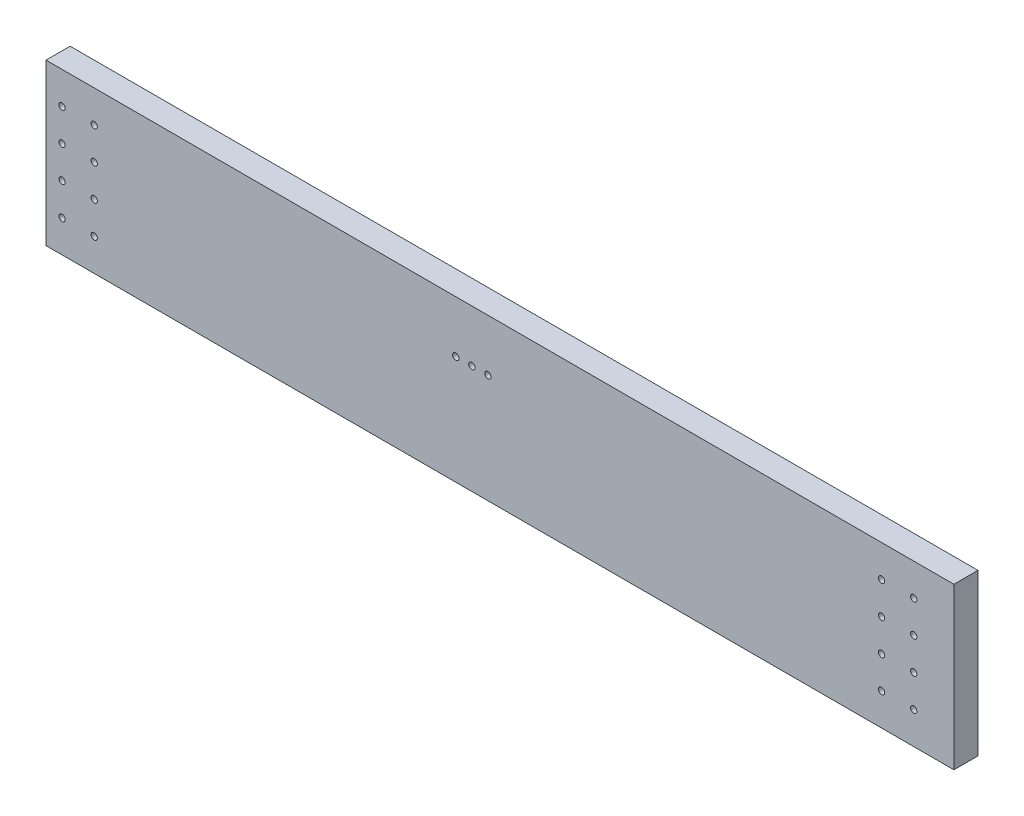
ISO-10303-21;
HEADER;
FILE_DESCRIPTION(('STEP AP214'),'2;1');
FILE_NAME('part.step','',(''),(''),'','','');
FILE_SCHEMA(('AUTOMOTIVE_DESIGN { 1 0 10303 214 1 1 1 1 }'));
ENDSEC;
DATA;
#1=APPLICATION_CONTEXT('core data for automotive mechanical design processes');
#2=APPLICATION_PROTOCOL_DEFINITION('international standard','automotive_design',2000,#1);
#3=PRODUCT_CONTEXT('',#1,'mechanical');
#4=PRODUCT('Part','Part','',(#3));
#5=PRODUCT_RELATED_PRODUCT_CATEGORY('part','',(#4));
#6=PRODUCT_DEFINITION_FORMATION('','',#4);
#7=PRODUCT_DEFINITION_CONTEXT('part definition',#1,'design');
#8=PRODUCT_DEFINITION('design','',#6,#7);
#9=PRODUCT_DEFINITION_SHAPE('','',#8);
#10=(LENGTH_UNIT() NAMED_UNIT(*) SI_UNIT(.MILLI.,.METRE.));
#11=(NAMED_UNIT(*) PLANE_ANGLE_UNIT() SI_UNIT($,.RADIAN.));
#12=(NAMED_UNIT(*) SI_UNIT($,.STERADIAN.) SOLID_ANGLE_UNIT());
#13=UNCERTAINTY_MEASURE_WITH_UNIT(LENGTH_MEASURE(1.E-05),#10,'distance_accuracy_value','');
#14=(GEOMETRIC_REPRESENTATION_CONTEXT(3) GLOBAL_UNCERTAINTY_ASSIGNED_CONTEXT((#13)) GLOBAL_UNIT_ASSIGNED_CONTEXT((#10,
#11,#12)) REPRESENTATION_CONTEXT('',''));
#15=CARTESIAN_POINT('',(0.,0.,0.));
#16=DIRECTION('',(0.,0.,1.));
#17=DIRECTION('',(1.,0.,0.));
#18=AXIS2_PLACEMENT_3D('',#15,#16,#17);
#19=CARTESIAN_POINT('',(0.,0.,19.05));
#20=DIRECTION('',(0.,1.,0.));
#21=DIRECTION('',(0.,0.,1.));
#22=AXIS2_PLACEMENT_3D('',#19,#20,#21);
#23=PLANE('',#22);
#24=DIRECTION('',(1.,0.,0.));
#25=VECTOR('',#24,1.);
#26=CARTESIAN_POINT('',(0.,0.,0.));
#27=LINE('',#26,#25);
#28=CARTESIAN_POINT('',(0.,0.,0.));
#29=VERTEX_POINT('',#28);
#30=CARTESIAN_POINT('',(717.55,0.,0.));
#31=VERTEX_POINT('',#30);
#32=EDGE_CURVE('E119',#29,#31,#27,.T.);
#33=ORIENTED_EDGE('',*,*,#32,.T.);
#34=DIRECTION('',(0.,0.,-1.));
#35=VECTOR('',#34,1.);
#36=CARTESIAN_POINT('',(717.55,0.,19.05));
#37=LINE('',#36,#35);
#38=CARTESIAN_POINT('',(717.55,0.,19.05));
#39=VERTEX_POINT('',#38);
#40=EDGE_CURVE('E11',#39,#31,#37,.T.);
#41=ORIENTED_EDGE('',*,*,#40,.F.);
#42=DIRECTION('',(1.,0.,0.));
#43=VECTOR('',#42,1.);
#44=CARTESIAN_POINT('',(0.,0.,19.05));
#45=LINE('',#44,#43);
#46=CARTESIAN_POINT('',(0.,0.,19.05));
#47=VERTEX_POINT('',#46);
#48=EDGE_CURVE('E99',#47,#39,#45,.T.);
#49=ORIENTED_EDGE('',*,*,#48,.F.);
#50=DIRECTION('',(0.,0.,-1.));
#51=VECTOR('',#50,1.);
#52=CARTESIAN_POINT('',(0.,0.,19.05));
#53=LINE('',#52,#51);
#54=EDGE_CURVE('E66',#47,#29,#53,.T.);
#55=ORIENTED_EDGE('',*,*,#54,.T.);
#56=EDGE_LOOP('',(#33,#41,#49,#55));
#57=FACE_BOUND('',#56,.T.);
#58=ADVANCED_FACE('F47',(#57),#23,.F.);
#59=CARTESIAN_POINT('',(717.55,0.,19.05));
#60=DIRECTION('',(-1.,0.,0.));
#61=DIRECTION('',(0.,0.,1.));
#62=AXIS2_PLACEMENT_3D('',#59,#60,#61);
#63=PLANE('',#62);
#64=DIRECTION('',(0.,1.,0.));
#65=VECTOR('',#64,1.);
#66=CARTESIAN_POINT('',(717.55,0.,0.));
#67=LINE('',#66,#65);
#68=CARTESIAN_POINT('',(717.55,127.,0.));
#69=VERTEX_POINT('',#68);
#70=EDGE_CURVE('E105',#31,#69,#67,.T.);
#71=ORIENTED_EDGE('',*,*,#70,.T.);
#72=DIRECTION('',(0.,0.,-1.));
#73=VECTOR('',#72,1.);
#74=CARTESIAN_POINT('',(717.55,127.,19.05));
#75=LINE('',#74,#73);
#76=CARTESIAN_POINT('',(717.55,127.,19.05));
#77=VERTEX_POINT('',#76);
#78=EDGE_CURVE('E57',#77,#69,#75,.T.);
#79=ORIENTED_EDGE('',*,*,#78,.F.);
#80=DIRECTION('',(0.,1.,0.));
#81=VECTOR('',#80,1.);
#82=CARTESIAN_POINT('',(717.55,0.,19.05));
#83=LINE('',#82,#81);
#84=EDGE_CURVE('E91',#39,#77,#83,.T.);
#85=ORIENTED_EDGE('',*,*,#84,.F.);
#86=ORIENTED_EDGE('',*,*,#40,.T.);
#87=EDGE_LOOP('',(#71,#79,#85,#86));
#88=FACE_BOUND('',#87,.T.);
#89=ADVANCED_FACE('F104',(#88),#63,.F.);
#90=CARTESIAN_POINT('',(0.,127.,19.05));
#91=DIRECTION('',(0.,1.,0.));
#92=DIRECTION('',(0.,0.,1.));
#93=AXIS2_PLACEMENT_3D('',#90,#91,#92);
#94=PLANE('',#93);
#95=DIRECTION('',(1.,0.,0.));
#96=VECTOR('',#95,1.);
#97=CARTESIAN_POINT('',(0.,127.,0.));
#98=LINE('',#97,#96);
#99=CARTESIAN_POINT('',(0.,127.,0.));
#100=VERTEX_POINT('',#99);
#101=EDGE_CURVE('E124',#100,#69,#98,.T.);
#102=ORIENTED_EDGE('',*,*,#101,.F.);
#103=DIRECTION('',(0.,0.,-1.));
#104=VECTOR('',#103,1.);
#105=CARTESIAN_POINT('',(0.,127.,19.05));
#106=LINE('',#105,#104);
#107=CARTESIAN_POINT('',(0.,127.,19.05));
#108=VERTEX_POINT('',#107);
#109=EDGE_CURVE('E80',#108,#100,#106,.T.);
#110=ORIENTED_EDGE('',*,*,#109,.F.);
#111=DIRECTION('',(1.,0.,0.));
#112=VECTOR('',#111,1.);
#113=CARTESIAN_POINT('',(0.,127.,19.05));
#114=LINE('',#113,#112);
#115=EDGE_CURVE('E98',#108,#77,#114,.T.);
#116=ORIENTED_EDGE('',*,*,#115,.T.);
#117=ORIENTED_EDGE('',*,*,#78,.T.);
#118=EDGE_LOOP('',(#102,#110,#116,#117));
#119=FACE_BOUND('',#118,.T.);
#120=ADVANCED_FACE('F110',(#119),#94,.T.);
#121=CARTESIAN_POINT('',(0.,0.,19.05));
#122=DIRECTION('',(-1.,0.,0.));
#123=DIRECTION('',(0.,0.,1.));
#124=AXIS2_PLACEMENT_3D('',#121,#122,#123);
#125=PLANE('',#124);
#126=DIRECTION('',(0.,1.,0.));
#127=VECTOR('',#126,1.);
#128=CARTESIAN_POINT('',(0.,0.,0.));
#129=LINE('',#128,#127);
#130=EDGE_CURVE('E127',#29,#100,#129,.T.);
#131=ORIENTED_EDGE('',*,*,#130,.F.);
#132=ORIENTED_EDGE('',*,*,#54,.F.);
#133=DIRECTION('',(0.,1.,0.));
#134=VECTOR('',#133,1.);
#135=CARTESIAN_POINT('',(0.,0.,19.05));
#136=LINE('',#135,#134);
#137=EDGE_CURVE('E112',#47,#108,#136,.T.);
#138=ORIENTED_EDGE('',*,*,#137,.T.);
#139=ORIENTED_EDGE('',*,*,#109,.T.);
#140=EDGE_LOOP('',(#131,#132,#138,#139));
#141=FACE_BOUND('',#140,.T.);
#142=ADVANCED_FACE('F228',(#141),#125,.T.);
#143=CARTESIAN_POINT('',(0.,0.,19.05));
#144=DIRECTION('',(0.,0.,1.));
#145=DIRECTION('',(1.,0.,0.));
#146=AXIS2_PLACEMENT_3D('',#143,#144,#145);
#147=PLANE('',#146);
#148=CARTESIAN_POINT('',(323.85,85.979,19.05));
#149=DIRECTION('',(0.,0.,1.));
#150=DIRECTION('',(1.,0.,0.));
#151=AXIS2_PLACEMENT_3D('',#148,#149,#150);
#152=CIRCLE('',#151,2.48920000000001);
#153=CARTESIAN_POINT('',(326.3392,85.979,19.05));
#154=VERTEX_POINT('',#153);
#155=EDGE_CURVE('E434',#154,#154,#152,.T.);
#156=ORIENTED_EDGE('',*,*,#155,.F.);
#157=EDGE_LOOP('',(#156));
#158=FACE_BOUND('',#157,.T.);
#159=CARTESIAN_POINT('',(336.55,85.979,19.05));
#160=DIRECTION('',(0.,0.,1.));
#161=DIRECTION('',(1.,0.,0.));
#162=AXIS2_PLACEMENT_3D('',#159,#160,#161);
#163=CIRCLE('',#162,2.48920000000001);
#164=CARTESIAN_POINT('',(339.0392,85.979,19.05));
#165=VERTEX_POINT('',#164);
#166=EDGE_CURVE('E457',#165,#165,#163,.T.);
#167=ORIENTED_EDGE('',*,*,#166,.F.);
#168=EDGE_LOOP('',(#167));
#169=FACE_BOUND('',#168,.T.);
#170=CARTESIAN_POINT('',(349.25,85.979,19.05));
#171=DIRECTION('',(0.,0.,1.));
#172=DIRECTION('',(1.,0.,0.));
#173=AXIS2_PLACEMENT_3D('',#170,#171,#172);
#174=CIRCLE('',#173,2.48920000000001);
#175=CARTESIAN_POINT('',(351.7392,85.979,19.05));
#176=VERTEX_POINT('',#175);
#177=EDGE_CURVE('E449',#176,#176,#174,.T.);
#178=ORIENTED_EDGE('',*,*,#177,.F.);
#179=EDGE_LOOP('',(#178));
#180=FACE_BOUND('',#179,.T.);
#181=CARTESIAN_POINT('',(38.1,25.4,19.05));
#182=DIRECTION('',(0.,0.,1.));
#183=DIRECTION('',(1.,0.,0.));
#184=AXIS2_PLACEMENT_3D('',#181,#182,#183);
#185=CIRCLE('',#184,2.4892);
#186=CARTESIAN_POINT('',(40.5892,25.4,19.05));
#187=VERTEX_POINT('',#186);
#188=EDGE_CURVE('E343',#187,#187,#185,.T.);
#189=ORIENTED_EDGE('',*,*,#188,.F.);
#190=EDGE_LOOP('',(#189));
#191=FACE_BOUND('',#190,.T.);
#192=CARTESIAN_POINT('',(12.7,76.2,19.05));
#193=DIRECTION('',(0.,0.,1.));
#194=DIRECTION('',(1.,0.,0.));
#195=AXIS2_PLACEMENT_3D('',#192,#193,#194);
#196=CIRCLE('',#195,2.4892);
#197=CARTESIAN_POINT('',(15.1892,76.2,19.05));
#198=VERTEX_POINT('',#197);
#199=EDGE_CURVE('E336',#198,#198,#196,.T.);
#200=ORIENTED_EDGE('',*,*,#199,.F.);
#201=EDGE_LOOP('',(#200));
#202=FACE_BOUND('',#201,.T.);
#203=CARTESIAN_POINT('',(12.7,50.8,19.05));
#204=DIRECTION('',(0.,0.,1.));
#205=DIRECTION('',(1.,0.,0.));
#206=AXIS2_PLACEMENT_3D('',#203,#204,#205);
#207=CIRCLE('',#206,2.48919999999999);
#208=CARTESIAN_POINT('',(15.1892,50.8,19.05));
#209=VERTEX_POINT('',#208);
#210=EDGE_CURVE('E329',#209,#209,#207,.T.);
#211=ORIENTED_EDGE('',*,*,#210,.F.);
#212=EDGE_LOOP('',(#211));
#213=FACE_BOUND('',#212,.T.);
#214=CARTESIAN_POINT('',(12.7,25.4,19.05));
#215=DIRECTION('',(0.,0.,1.));
#216=DIRECTION('',(1.,0.,0.));
#217=AXIS2_PLACEMENT_3D('',#214,#215,#216);
#218=CIRCLE('',#217,2.4892);
#219=CARTESIAN_POINT('',(15.1892,25.4,19.05));
#220=VERTEX_POINT('',#219);
#221=EDGE_CURVE('E315',#220,#220,#218,.T.);
#222=ORIENTED_EDGE('',*,*,#221,.F.);
#223=EDGE_LOOP('',(#222));
#224=FACE_BOUND('',#223,.T.);
#225=CARTESIAN_POINT('',(38.1,50.8,19.05));
#226=DIRECTION('',(0.,0.,1.));
#227=DIRECTION('',(1.,0.,0.));
#228=AXIS2_PLACEMENT_3D('',#225,#226,#227);
#229=CIRCLE('',#228,2.4892);
#230=CARTESIAN_POINT('',(40.5892,50.8,19.05));
#231=VERTEX_POINT('',#230);
#232=EDGE_CURVE('E346',#231,#231,#229,.T.);
#233=ORIENTED_EDGE('',*,*,#232,.F.);
#234=EDGE_LOOP('',(#233));
#235=FACE_BOUND('',#234,.T.);
#236=CARTESIAN_POINT('',(38.1,76.2,19.05));
#237=DIRECTION('',(0.,0.,1.));
#238=DIRECTION('',(1.,0.,0.));
#239=AXIS2_PLACEMENT_3D('',#236,#237,#238);
#240=CIRCLE('',#239,2.4892);
#241=CARTESIAN_POINT('',(40.5892,76.2,19.05));
#242=VERTEX_POINT('',#241);
#243=EDGE_CURVE('E356',#242,#242,#240,.T.);
#244=ORIENTED_EDGE('',*,*,#243,.F.);
#245=EDGE_LOOP('',(#244));
#246=FACE_BOUND('',#245,.T.);
#247=CARTESIAN_POINT('',(38.1,101.6,19.05));
#248=DIRECTION('',(0.,0.,1.));
#249=DIRECTION('',(1.,0.,0.));
#250=AXIS2_PLACEMENT_3D('',#247,#248,#249);
#251=CIRCLE('',#250,2.4892);
#252=CARTESIAN_POINT('',(40.5892,101.6,19.05));
#253=VERTEX_POINT('',#252);
#254=EDGE_CURVE('E352',#253,#253,#251,.T.);
#255=ORIENTED_EDGE('',*,*,#254,.F.);
#256=EDGE_LOOP('',(#255));
#257=FACE_BOUND('',#256,.T.);
#258=CARTESIAN_POINT('',(685.8,101.6,19.05));
#259=DIRECTION('',(0.,0.,1.));
#260=DIRECTION('',(1.,0.,0.));
#261=AXIS2_PLACEMENT_3D('',#258,#259,#260);
#262=CIRCLE('',#261,2.48919999999995);
#263=CARTESIAN_POINT('',(688.2892,101.6,19.05));
#264=VERTEX_POINT('',#263);
#265=EDGE_CURVE('E272',#264,#264,#262,.T.);
#266=ORIENTED_EDGE('',*,*,#265,.F.);
#267=EDGE_LOOP('',(#266));
#268=FACE_BOUND('',#267,.T.);
#269=CARTESIAN_POINT('',(660.4,101.6,19.05));
#270=DIRECTION('',(0.,0.,1.));
#271=DIRECTION('',(1.,0.,0.));
#272=AXIS2_PLACEMENT_3D('',#269,#270,#271);
#273=CIRCLE('',#272,2.48919999999995);
#274=CARTESIAN_POINT('',(662.8892,101.6,19.05));
#275=VERTEX_POINT('',#274);
#276=EDGE_CURVE('E330',#275,#275,#273,.T.);
#277=ORIENTED_EDGE('',*,*,#276,.F.);
#278=EDGE_LOOP('',(#277));
#279=FACE_BOUND('',#278,.T.);
#280=CARTESIAN_POINT('',(660.4,76.2,19.05));
#281=DIRECTION('',(0.,0.,1.));
#282=DIRECTION('',(1.,0.,0.));
#283=AXIS2_PLACEMENT_3D('',#280,#281,#282);
#284=CIRCLE('',#283,2.48919999999995);
#285=CARTESIAN_POINT('',(662.8892,76.2,19.05));
#286=VERTEX_POINT('',#285);
#287=EDGE_CURVE('E339',#286,#286,#284,.T.);
#288=ORIENTED_EDGE('',*,*,#287,.F.);
#289=EDGE_LOOP('',(#288));
#290=FACE_BOUND('',#289,.T.);
#291=CARTESIAN_POINT('',(660.4,50.8,19.05));
#292=DIRECTION('',(0.,0.,1.));
#293=DIRECTION('',(1.,0.,0.));
#294=AXIS2_PLACEMENT_3D('',#291,#292,#293);
#295=CIRCLE('',#294,2.48919999999995);
#296=CARTESIAN_POINT('',(662.8892,50.8,19.05));
#297=VERTEX_POINT('',#296);
#298=EDGE_CURVE('E412',#297,#297,#295,.T.);
#299=ORIENTED_EDGE('',*,*,#298,.F.);
#300=EDGE_LOOP('',(#299));
#301=FACE_BOUND('',#300,.T.);
#302=CARTESIAN_POINT('',(660.4,25.4,19.05));
#303=DIRECTION('',(0.,0.,1.));
#304=DIRECTION('',(1.,0.,0.));
#305=AXIS2_PLACEMENT_3D('',#302,#303,#304);
#306=CIRCLE('',#305,2.48919999999995);
#307=CARTESIAN_POINT('',(662.8892,25.4,19.05));
#308=VERTEX_POINT('',#307);
#309=EDGE_CURVE('E416',#308,#308,#306,.T.);
#310=ORIENTED_EDGE('',*,*,#309,.F.);
#311=EDGE_LOOP('',(#310));
#312=FACE_BOUND('',#311,.T.);
#313=CARTESIAN_POINT('',(685.8,76.2,19.05));
#314=DIRECTION('',(0.,0.,1.));
#315=DIRECTION('',(1.,0.,0.));
#316=AXIS2_PLACEMENT_3D('',#313,#314,#315);
#317=CIRCLE('',#316,2.48919999999995);
#318=CARTESIAN_POINT('',(688.2892,76.2,19.05));
#319=VERTEX_POINT('',#318);
#320=EDGE_CURVE('E420',#319,#319,#317,.T.);
#321=ORIENTED_EDGE('',*,*,#320,.F.);
#322=EDGE_LOOP('',(#321));
#323=FACE_BOUND('',#322,.T.);
#324=CARTESIAN_POINT('',(685.8,50.8,19.05));
#325=DIRECTION('',(0.,0.,1.));
#326=DIRECTION('',(1.,0.,0.));
#327=AXIS2_PLACEMENT_3D('',#324,#325,#326);
#328=CIRCLE('',#327,2.48919999999995);
#329=CARTESIAN_POINT('',(688.2892,50.8,19.05));
#330=VERTEX_POINT('',#329);
#331=EDGE_CURVE('E424',#330,#330,#328,.T.);
#332=ORIENTED_EDGE('',*,*,#331,.F.);
#333=EDGE_LOOP('',(#332));
#334=FACE_BOUND('',#333,.T.);
#335=CARTESIAN_POINT('',(685.8,25.4,19.05));
#336=DIRECTION('',(0.,0.,1.));
#337=DIRECTION('',(1.,0.,0.));
#338=AXIS2_PLACEMENT_3D('',#335,#336,#337);
#339=CIRCLE('',#338,2.48919999999995);
#340=CARTESIAN_POINT('',(688.2892,25.4,19.05));
#341=VERTEX_POINT('',#340);
#342=EDGE_CURVE('E426',#341,#341,#339,.T.);
#343=ORIENTED_EDGE('',*,*,#342,.F.);
#344=EDGE_LOOP('',(#343));
#345=FACE_BOUND('',#344,.T.);
#346=CARTESIAN_POINT('',(12.7,101.6,19.05));
#347=DIRECTION('',(0.,0.,1.));
#348=DIRECTION('',(1.,0.,0.));
#349=AXIS2_PLACEMENT_3D('',#346,#347,#348);
#350=CIRCLE('',#349,2.48919999999999);
#351=CARTESIAN_POINT('',(15.1892,101.6,19.05));
#352=VERTEX_POINT('',#351);
#353=EDGE_CURVE('E140',#352,#352,#350,.T.);
#354=ORIENTED_EDGE('',*,*,#353,.F.);
#355=EDGE_LOOP('',(#354));
#356=FACE_BOUND('',#355,.T.);
#357=ORIENTED_EDGE('',*,*,#48,.T.);
#358=ORIENTED_EDGE('',*,*,#84,.T.);
#359=ORIENTED_EDGE('',*,*,#115,.F.);
#360=ORIENTED_EDGE('',*,*,#137,.F.);
#361=EDGE_LOOP('',(#357,#358,#359,#360));
#362=FACE_BOUND('',#361,.T.);
#363=ADVANCED_FACE('F95',(#158,#169,#180,#191,#202,#213,#224,#235,#246,#257,#268,#279,#290,#301,
#312,#323,#334,#345,#356,#362),#147,.T.);
#364=CARTESIAN_POINT('',(0.,0.,0.));
#365=DIRECTION('',(0.,0.,1.));
#366=DIRECTION('',(1.,0.,0.));
#367=AXIS2_PLACEMENT_3D('',#364,#365,#366);
#368=PLANE('',#367);
#369=CARTESIAN_POINT('',(323.85,85.979,0.));
#370=DIRECTION('',(0.,0.,1.));
#371=DIRECTION('',(1.,0.,0.));
#372=AXIS2_PLACEMENT_3D('',#369,#370,#371);
#373=CIRCLE('',#372,2.48920000000001);
#374=CARTESIAN_POINT('',(326.3392,85.979,0.));
#375=VERTEX_POINT('',#374);
#376=EDGE_CURVE('E428',#375,#375,#373,.T.);
#377=ORIENTED_EDGE('',*,*,#376,.T.);
#378=EDGE_LOOP('',(#377));
#379=FACE_BOUND('',#378,.T.);
#380=CARTESIAN_POINT('',(336.55,85.979,0.));
#381=DIRECTION('',(0.,0.,1.));
#382=DIRECTION('',(1.,0.,0.));
#383=AXIS2_PLACEMENT_3D('',#380,#381,#382);
#384=CIRCLE('',#383,2.48920000000001);
#385=CARTESIAN_POINT('',(339.0392,85.979,0.));
#386=VERTEX_POINT('',#385);
#387=EDGE_CURVE('E453',#386,#386,#384,.T.);
#388=ORIENTED_EDGE('',*,*,#387,.T.);
#389=EDGE_LOOP('',(#388));
#390=FACE_BOUND('',#389,.T.);
#391=CARTESIAN_POINT('',(349.25,85.979,0.));
#392=DIRECTION('',(0.,0.,1.));
#393=DIRECTION('',(1.,0.,0.));
#394=AXIS2_PLACEMENT_3D('',#391,#392,#393);
#395=CIRCLE('',#394,2.48920000000001);
#396=CARTESIAN_POINT('',(351.7392,85.979,0.));
#397=VERTEX_POINT('',#396);
#398=EDGE_CURVE('E445',#397,#397,#395,.T.);
#399=ORIENTED_EDGE('',*,*,#398,.T.);
#400=EDGE_LOOP('',(#399));
#401=FACE_BOUND('',#400,.T.);
#402=CARTESIAN_POINT('',(38.1,25.4,0.));
#403=DIRECTION('',(0.,0.,1.));
#404=DIRECTION('',(1.,0.,0.));
#405=AXIS2_PLACEMENT_3D('',#402,#403,#404);
#406=CIRCLE('',#405,2.4892);
#407=CARTESIAN_POINT('',(40.5892,25.4,0.));
#408=VERTEX_POINT('',#407);
#409=EDGE_CURVE('E50',#408,#408,#406,.T.);
#410=ORIENTED_EDGE('',*,*,#409,.T.);
#411=EDGE_LOOP('',(#410));
#412=FACE_BOUND('',#411,.T.);
#413=CARTESIAN_POINT('',(12.7,76.2,0.));
#414=DIRECTION('',(0.,0.,1.));
#415=DIRECTION('',(1.,0.,0.));
#416=AXIS2_PLACEMENT_3D('',#413,#414,#415);
#417=CIRCLE('',#416,2.4892);
#418=CARTESIAN_POINT('',(15.1892,76.2,0.));
#419=VERTEX_POINT('',#418);
#420=EDGE_CURVE('E191',#419,#419,#417,.T.);
#421=ORIENTED_EDGE('',*,*,#420,.T.);
#422=EDGE_LOOP('',(#421));
#423=FACE_BOUND('',#422,.T.);
#424=CARTESIAN_POINT('',(12.7,50.8,0.));
#425=DIRECTION('',(0.,0.,1.));
#426=DIRECTION('',(1.,0.,0.));
#427=AXIS2_PLACEMENT_3D('',#424,#425,#426);
#428=CIRCLE('',#427,2.48919999999999);
#429=CARTESIAN_POINT('',(15.1892,50.8,0.));
#430=VERTEX_POINT('',#429);
#431=EDGE_CURVE('E188',#430,#430,#428,.T.);
#432=ORIENTED_EDGE('',*,*,#431,.T.);
#433=EDGE_LOOP('',(#432));
#434=FACE_BOUND('',#433,.T.);
#435=CARTESIAN_POINT('',(12.7,25.4,0.));
#436=DIRECTION('',(0.,0.,1.));
#437=DIRECTION('',(1.,0.,0.));
#438=AXIS2_PLACEMENT_3D('',#435,#436,#437);
#439=CIRCLE('',#438,2.4892);
#440=CARTESIAN_POINT('',(15.1892,25.4,0.));
#441=VERTEX_POINT('',#440);
#442=EDGE_CURVE('E184',#441,#441,#439,.T.);
#443=ORIENTED_EDGE('',*,*,#442,.T.);
#444=EDGE_LOOP('',(#443));
#445=FACE_BOUND('',#444,.T.);
#446=CARTESIAN_POINT('',(38.1,50.8,0.));
#447=DIRECTION('',(0.,0.,1.));
#448=DIRECTION('',(1.,0.,0.));
#449=AXIS2_PLACEMENT_3D('',#446,#447,#448);
#450=CIRCLE('',#449,2.4892);
#451=CARTESIAN_POINT('',(40.5892,50.8,0.));
#452=VERTEX_POINT('',#451);
#453=EDGE_CURVE('E180',#452,#452,#450,.T.);
#454=ORIENTED_EDGE('',*,*,#453,.T.);
#455=EDGE_LOOP('',(#454));
#456=FACE_BOUND('',#455,.T.);
#457=CARTESIAN_POINT('',(38.1,76.2,0.));
#458=DIRECTION('',(0.,0.,1.));
#459=DIRECTION('',(1.,0.,0.));
#460=AXIS2_PLACEMENT_3D('',#457,#458,#459);
#461=CIRCLE('',#460,2.4892);
#462=CARTESIAN_POINT('',(40.5892,76.2,0.));
#463=VERTEX_POINT('',#462);
#464=EDGE_CURVE('E176',#463,#463,#461,.T.);
#465=ORIENTED_EDGE('',*,*,#464,.T.);
#466=EDGE_LOOP('',(#465));
#467=FACE_BOUND('',#466,.T.);
#468=CARTESIAN_POINT('',(38.1,101.6,0.));
#469=DIRECTION('',(0.,0.,1.));
#470=DIRECTION('',(1.,0.,0.));
#471=AXIS2_PLACEMENT_3D('',#468,#469,#470);
#472=CIRCLE('',#471,2.4892);
#473=CARTESIAN_POINT('',(40.5892,101.6,0.));
#474=VERTEX_POINT('',#473);
#475=EDGE_CURVE('E172',#474,#474,#472,.T.);
#476=ORIENTED_EDGE('',*,*,#475,.T.);
#477=EDGE_LOOP('',(#476));
#478=FACE_BOUND('',#477,.T.);
#479=CARTESIAN_POINT('',(685.8,101.6,0.));
#480=DIRECTION('',(0.,0.,1.));
#481=DIRECTION('',(1.,0.,0.));
#482=AXIS2_PLACEMENT_3D('',#479,#480,#481);
#483=CIRCLE('',#482,2.48919999999995);
#484=CARTESIAN_POINT('',(688.2892,101.6,0.));
#485=VERTEX_POINT('',#484);
#486=EDGE_CURVE('E168',#485,#485,#483,.T.);
#487=ORIENTED_EDGE('',*,*,#486,.T.);
#488=EDGE_LOOP('',(#487));
#489=FACE_BOUND('',#488,.T.);
#490=CARTESIAN_POINT('',(660.4,101.6,0.));
#491=DIRECTION('',(0.,0.,1.));
#492=DIRECTION('',(1.,0.,0.));
#493=AXIS2_PLACEMENT_3D('',#490,#491,#492);
#494=CIRCLE('',#493,2.48919999999995);
#495=CARTESIAN_POINT('',(662.8892,101.6,0.));
#496=VERTEX_POINT('',#495);
#497=EDGE_CURVE('E164',#496,#496,#494,.T.);
#498=ORIENTED_EDGE('',*,*,#497,.T.);
#499=EDGE_LOOP('',(#498));
#500=FACE_BOUND('',#499,.T.);
#501=CARTESIAN_POINT('',(660.4,76.2,0.));
#502=DIRECTION('',(0.,0.,1.));
#503=DIRECTION('',(1.,0.,0.));
#504=AXIS2_PLACEMENT_3D('',#501,#502,#503);
#505=CIRCLE('',#504,2.48919999999995);
#506=CARTESIAN_POINT('',(662.8892,76.2,0.));
#507=VERTEX_POINT('',#506);
#508=EDGE_CURVE('E160',#507,#507,#505,.T.);
#509=ORIENTED_EDGE('',*,*,#508,.T.);
#510=EDGE_LOOP('',(#509));
#511=FACE_BOUND('',#510,.T.);
#512=CARTESIAN_POINT('',(660.4,50.8,0.));
#513=DIRECTION('',(0.,0.,1.));
#514=DIRECTION('',(1.,0.,0.));
#515=AXIS2_PLACEMENT_3D('',#512,#513,#514);
#516=CIRCLE('',#515,2.48919999999995);
#517=CARTESIAN_POINT('',(662.8892,50.8,0.));
#518=VERTEX_POINT('',#517);
#519=EDGE_CURVE('E156',#518,#518,#516,.T.);
#520=ORIENTED_EDGE('',*,*,#519,.T.);
#521=EDGE_LOOP('',(#520));
#522=FACE_BOUND('',#521,.T.);
#523=CARTESIAN_POINT('',(660.4,25.4,0.));
#524=DIRECTION('',(0.,0.,1.));
#525=DIRECTION('',(1.,0.,0.));
#526=AXIS2_PLACEMENT_3D('',#523,#524,#525);
#527=CIRCLE('',#526,2.48919999999995);
#528=CARTESIAN_POINT('',(662.8892,25.4,0.));
#529=VERTEX_POINT('',#528);
#530=EDGE_CURVE('E152',#529,#529,#527,.T.);
#531=ORIENTED_EDGE('',*,*,#530,.T.);
#532=EDGE_LOOP('',(#531));
#533=FACE_BOUND('',#532,.T.);
#534=CARTESIAN_POINT('',(685.8,76.2,0.));
#535=DIRECTION('',(0.,0.,1.));
#536=DIRECTION('',(1.,0.,0.));
#537=AXIS2_PLACEMENT_3D('',#534,#535,#536);
#538=CIRCLE('',#537,2.48919999999995);
#539=CARTESIAN_POINT('',(688.2892,76.2,0.));
#540=VERTEX_POINT('',#539);
#541=EDGE_CURVE('E148',#540,#540,#538,.T.);
#542=ORIENTED_EDGE('',*,*,#541,.T.);
#543=EDGE_LOOP('',(#542));
#544=FACE_BOUND('',#543,.T.);
#545=CARTESIAN_POINT('',(685.8,50.8,0.));
#546=DIRECTION('',(0.,0.,1.));
#547=DIRECTION('',(1.,0.,0.));
#548=AXIS2_PLACEMENT_3D('',#545,#546,#547);
#549=CIRCLE('',#548,2.48919999999995);
#550=CARTESIAN_POINT('',(688.2892,50.8,0.));
#551=VERTEX_POINT('',#550);
#552=EDGE_CURVE('E144',#551,#551,#549,.T.);
#553=ORIENTED_EDGE('',*,*,#552,.T.);
#554=EDGE_LOOP('',(#553));
#555=FACE_BOUND('',#554,.T.);
#556=CARTESIAN_POINT('',(685.8,25.4,0.));
#557=DIRECTION('',(0.,0.,1.));
#558=DIRECTION('',(1.,0.,0.));
#559=AXIS2_PLACEMENT_3D('',#556,#557,#558);
#560=CIRCLE('',#559,2.48919999999995);
#561=CARTESIAN_POINT('',(688.2892,25.4,0.));
#562=VERTEX_POINT('',#561);
#563=EDGE_CURVE('E139',#562,#562,#560,.T.);
#564=ORIENTED_EDGE('',*,*,#563,.T.);
#565=EDGE_LOOP('',(#564));
#566=FACE_BOUND('',#565,.T.);
#567=CARTESIAN_POINT('',(12.7,101.6,0.));
#568=DIRECTION('',(0.,0.,1.));
#569=DIRECTION('',(1.,0.,0.));
#570=AXIS2_PLACEMENT_3D('',#567,#568,#569);
#571=CIRCLE('',#570,2.48919999999999);
#572=CARTESIAN_POINT('',(15.1892,101.6,0.));
#573=VERTEX_POINT('',#572);
#574=EDGE_CURVE('E135',#573,#573,#571,.T.);
#575=ORIENTED_EDGE('',*,*,#574,.T.);
#576=EDGE_LOOP('',(#575));
#577=FACE_BOUND('',#576,.T.);
#578=ORIENTED_EDGE('',*,*,#32,.F.);
#579=ORIENTED_EDGE('',*,*,#130,.T.);
#580=ORIENTED_EDGE('',*,*,#101,.T.);
#581=ORIENTED_EDGE('',*,*,#70,.F.);
#582=EDGE_LOOP('',(#578,#579,#580,#581));
#583=FACE_BOUND('',#582,.T.);
#584=ADVANCED_FACE('F202',(#379,#390,#401,#412,#423,#434,#445,#456,#467,#478,#489,#500,#511,
#522,#533,#544,#555,#566,#577,#583),#368,.F.);
#585=CARTESIAN_POINT('',(12.7,101.6,-6.35));
#586=DIRECTION('',(0.,0.,1.));
#587=DIRECTION('',(1.,0.,0.));
#588=AXIS2_PLACEMENT_3D('',#585,#586,#587);
#589=CYLINDRICAL_SURFACE('',#588,2.48919999999999);
#590=ORIENTED_EDGE('',*,*,#353,.T.);
#591=EDGE_LOOP('',(#590));
#592=FACE_BOUND('',#591,.T.);
#593=ORIENTED_EDGE('',*,*,#574,.F.);
#594=EDGE_LOOP('',(#593));
#595=FACE_BOUND('',#594,.T.);
#596=ADVANCED_FACE('F240',(#592,#595),#589,.F.);
#597=CARTESIAN_POINT('',(685.8,25.4,-6.35));
#598=DIRECTION('',(0.,0.,1.));
#599=DIRECTION('',(1.,0.,0.));
#600=AXIS2_PLACEMENT_3D('',#597,#598,#599);
#601=CYLINDRICAL_SURFACE('',#600,2.48919999999995);
#602=ORIENTED_EDGE('',*,*,#342,.T.);
#603=EDGE_LOOP('',(#602));
#604=FACE_BOUND('',#603,.T.);
#605=ORIENTED_EDGE('',*,*,#563,.F.);
#606=EDGE_LOOP('',(#605));
#607=FACE_BOUND('',#606,.T.);
#608=ADVANCED_FACE('F244',(#604,#607),#601,.F.);
#609=CARTESIAN_POINT('',(685.8,50.8,-6.35));
#610=DIRECTION('',(0.,0.,1.));
#611=DIRECTION('',(1.,0.,0.));
#612=AXIS2_PLACEMENT_3D('',#609,#610,#611);
#613=CYLINDRICAL_SURFACE('',#612,2.48919999999995);
#614=ORIENTED_EDGE('',*,*,#331,.T.);
#615=EDGE_LOOP('',(#614));
#616=FACE_BOUND('',#615,.T.);
#617=ORIENTED_EDGE('',*,*,#552,.F.);
#618=EDGE_LOOP('',(#617));
#619=FACE_BOUND('',#618,.T.);
#620=ADVANCED_FACE('F294',(#616,#619),#613,.F.);
#621=CARTESIAN_POINT('',(685.8,76.2,-6.35));
#622=DIRECTION('',(0.,0.,1.));
#623=DIRECTION('',(1.,0.,0.));
#624=AXIS2_PLACEMENT_3D('',#621,#622,#623);
#625=CYLINDRICAL_SURFACE('',#624,2.48919999999995);
#626=ORIENTED_EDGE('',*,*,#320,.T.);
#627=EDGE_LOOP('',(#626));
#628=FACE_BOUND('',#627,.T.);
#629=ORIENTED_EDGE('',*,*,#541,.F.);
#630=EDGE_LOOP('',(#629));
#631=FACE_BOUND('',#630,.T.);
#632=ADVANCED_FACE('F300',(#628,#631),#625,.F.);
#633=CARTESIAN_POINT('',(660.4,25.4,-6.35));
#634=DIRECTION('',(0.,0.,1.));
#635=DIRECTION('',(1.,0.,0.));
#636=AXIS2_PLACEMENT_3D('',#633,#634,#635);
#637=CYLINDRICAL_SURFACE('',#636,2.48919999999995);
#638=ORIENTED_EDGE('',*,*,#309,.T.);
#639=EDGE_LOOP('',(#638));
#640=FACE_BOUND('',#639,.T.);
#641=ORIENTED_EDGE('',*,*,#530,.F.);
#642=EDGE_LOOP('',(#641));
#643=FACE_BOUND('',#642,.T.);
#644=ADVANCED_FACE('F499',(#640,#643),#637,.F.);
#645=CARTESIAN_POINT('',(660.4,50.8,-6.35));
#646=DIRECTION('',(0.,0.,1.));
#647=DIRECTION('',(1.,0.,0.));
#648=AXIS2_PLACEMENT_3D('',#645,#646,#647);
#649=CYLINDRICAL_SURFACE('',#648,2.48919999999995);
#650=ORIENTED_EDGE('',*,*,#298,.T.);
#651=EDGE_LOOP('',(#650));
#652=FACE_BOUND('',#651,.T.);
#653=ORIENTED_EDGE('',*,*,#519,.F.);
#654=EDGE_LOOP('',(#653));
#655=FACE_BOUND('',#654,.T.);
#656=ADVANCED_FACE('F495',(#652,#655),#649,.F.);
#657=CARTESIAN_POINT('',(660.4,76.2,-6.35));
#658=DIRECTION('',(0.,0.,1.));
#659=DIRECTION('',(1.,0.,0.));
#660=AXIS2_PLACEMENT_3D('',#657,#658,#659);
#661=CYLINDRICAL_SURFACE('',#660,2.48919999999995);
#662=ORIENTED_EDGE('',*,*,#287,.T.);
#663=EDGE_LOOP('',(#662));
#664=FACE_BOUND('',#663,.T.);
#665=ORIENTED_EDGE('',*,*,#508,.F.);
#666=EDGE_LOOP('',(#665));
#667=FACE_BOUND('',#666,.T.);
#668=ADVANCED_FACE('F266',(#664,#667),#661,.F.);
#669=CARTESIAN_POINT('',(660.4,101.6,-6.35));
#670=DIRECTION('',(0.,0.,1.));
#671=DIRECTION('',(1.,0.,0.));
#672=AXIS2_PLACEMENT_3D('',#669,#670,#671);
#673=CYLINDRICAL_SURFACE('',#672,2.48919999999995);
#674=ORIENTED_EDGE('',*,*,#276,.T.);
#675=EDGE_LOOP('',(#674));
#676=FACE_BOUND('',#675,.T.);
#677=ORIENTED_EDGE('',*,*,#497,.F.);
#678=EDGE_LOOP('',(#677));
#679=FACE_BOUND('',#678,.T.);
#680=ADVANCED_FACE('F261',(#676,#679),#673,.F.);
#681=CARTESIAN_POINT('',(685.8,101.6,-6.35));
#682=DIRECTION('',(0.,0.,1.));
#683=DIRECTION('',(1.,0.,0.));
#684=AXIS2_PLACEMENT_3D('',#681,#682,#683);
#685=CYLINDRICAL_SURFACE('',#684,2.48919999999995);
#686=ORIENTED_EDGE('',*,*,#265,.T.);
#687=EDGE_LOOP('',(#686));
#688=FACE_BOUND('',#687,.T.);
#689=ORIENTED_EDGE('',*,*,#486,.F.);
#690=EDGE_LOOP('',(#689));
#691=FACE_BOUND('',#690,.T.);
#692=ADVANCED_FACE('F258',(#688,#691),#685,.F.);
#693=CARTESIAN_POINT('',(38.1,101.6,-6.35));
#694=DIRECTION('',(0.,0.,1.));
#695=DIRECTION('',(1.,0.,0.));
#696=AXIS2_PLACEMENT_3D('',#693,#694,#695);
#697=CYLINDRICAL_SURFACE('',#696,2.4892);
#698=ORIENTED_EDGE('',*,*,#254,.T.);
#699=EDGE_LOOP('',(#698));
#700=FACE_BOUND('',#699,.T.);
#701=ORIENTED_EDGE('',*,*,#475,.F.);
#702=EDGE_LOOP('',(#701));
#703=FACE_BOUND('',#702,.T.);
#704=ADVANCED_FACE('F254',(#700,#703),#697,.F.);
#705=CARTESIAN_POINT('',(38.1,76.2,-6.35));
#706=DIRECTION('',(0.,0.,1.));
#707=DIRECTION('',(1.,0.,0.));
#708=AXIS2_PLACEMENT_3D('',#705,#706,#707);
#709=CYLINDRICAL_SURFACE('',#708,2.4892);
#710=ORIENTED_EDGE('',*,*,#243,.T.);
#711=EDGE_LOOP('',(#710));
#712=FACE_BOUND('',#711,.T.);
#713=ORIENTED_EDGE('',*,*,#464,.F.);
#714=EDGE_LOOP('',(#713));
#715=FACE_BOUND('',#714,.T.);
#716=ADVANCED_FACE('F250',(#712,#715),#709,.F.);
#717=CARTESIAN_POINT('',(38.1,50.8,-6.35));
#718=DIRECTION('',(0.,0.,1.));
#719=DIRECTION('',(1.,0.,0.));
#720=AXIS2_PLACEMENT_3D('',#717,#718,#719);
#721=CYLINDRICAL_SURFACE('',#720,2.4892);
#722=ORIENTED_EDGE('',*,*,#232,.T.);
#723=EDGE_LOOP('',(#722));
#724=FACE_BOUND('',#723,.T.);
#725=ORIENTED_EDGE('',*,*,#453,.F.);
#726=EDGE_LOOP('',(#725));
#727=FACE_BOUND('',#726,.T.);
#728=ADVANCED_FACE('F246',(#724,#727),#721,.F.);
#729=CARTESIAN_POINT('',(12.7,25.4,-6.35));
#730=DIRECTION('',(0.,0.,1.));
#731=DIRECTION('',(1.,0.,0.));
#732=AXIS2_PLACEMENT_3D('',#729,#730,#731);
#733=CYLINDRICAL_SURFACE('',#732,2.4892);
#734=ORIENTED_EDGE('',*,*,#221,.T.);
#735=EDGE_LOOP('',(#734));
#736=FACE_BOUND('',#735,.T.);
#737=ORIENTED_EDGE('',*,*,#442,.F.);
#738=EDGE_LOOP('',(#737));
#739=FACE_BOUND('',#738,.T.);
#740=ADVANCED_FACE('F249',(#736,#739),#733,.F.);
#741=CARTESIAN_POINT('',(12.7,50.8,-6.35));
#742=DIRECTION('',(0.,0.,1.));
#743=DIRECTION('',(1.,0.,0.));
#744=AXIS2_PLACEMENT_3D('',#741,#742,#743);
#745=CYLINDRICAL_SURFACE('',#744,2.48919999999999);
#746=ORIENTED_EDGE('',*,*,#210,.T.);
#747=EDGE_LOOP('',(#746));
#748=FACE_BOUND('',#747,.T.);
#749=ORIENTED_EDGE('',*,*,#431,.F.);
#750=EDGE_LOOP('',(#749));
#751=FACE_BOUND('',#750,.T.);
#752=ADVANCED_FACE('F218',(#748,#751),#745,.F.);
#753=CARTESIAN_POINT('',(12.7,76.2,-6.35));
#754=DIRECTION('',(0.,0.,1.));
#755=DIRECTION('',(1.,0.,0.));
#756=AXIS2_PLACEMENT_3D('',#753,#754,#755);
#757=CYLINDRICAL_SURFACE('',#756,2.4892);
#758=ORIENTED_EDGE('',*,*,#199,.T.);
#759=EDGE_LOOP('',(#758));
#760=FACE_BOUND('',#759,.T.);
#761=ORIENTED_EDGE('',*,*,#420,.F.);
#762=EDGE_LOOP('',(#761));
#763=FACE_BOUND('',#762,.T.);
#764=ADVANCED_FACE('F207',(#760,#763),#757,.F.);
#765=CARTESIAN_POINT('',(38.1,25.4,-6.35));
#766=DIRECTION('',(0.,0.,1.));
#767=DIRECTION('',(1.,0.,0.));
#768=AXIS2_PLACEMENT_3D('',#765,#766,#767);
#769=CYLINDRICAL_SURFACE('',#768,2.4892);
#770=ORIENTED_EDGE('',*,*,#188,.T.);
#771=EDGE_LOOP('',(#770));
#772=FACE_BOUND('',#771,.T.);
#773=ORIENTED_EDGE('',*,*,#409,.F.);
#774=EDGE_LOOP('',(#773));
#775=FACE_BOUND('',#774,.T.);
#776=ADVANCED_FACE('F204',(#772,#775),#769,.F.);
#777=CARTESIAN_POINT('',(349.25,85.979,0.));
#778=DIRECTION('',(0.,0.,1.));
#779=DIRECTION('',(1.,0.,0.));
#780=AXIS2_PLACEMENT_3D('',#777,#778,#779);
#781=CYLINDRICAL_SURFACE('',#780,2.48920000000001);
#782=CARTESIAN_POINT('',(351.7392,85.979,0.));
#783=CARTESIAN_POINT('',(351.7392,85.979,0.1984375));
#784=CARTESIAN_POINT('',(351.7392,85.979,0.396875));
#785=CARTESIAN_POINT('',(351.7392,85.979,0.79375));
#786=CARTESIAN_POINT('',(351.7392,85.979,0.9921875));
#787=CARTESIAN_POINT('',(351.7392,85.979,1.3890625));
#788=CARTESIAN_POINT('',(351.7392,85.979,1.5875));
#789=CARTESIAN_POINT('',(351.7392,85.979,1.984375));
#790=CARTESIAN_POINT('',(351.7392,85.979,2.1828125));
#791=CARTESIAN_POINT('',(351.7392,85.979,2.5796875));
#792=CARTESIAN_POINT('',(351.7392,85.979,2.778125));
#793=CARTESIAN_POINT('',(351.7392,85.979,3.175));
#794=CARTESIAN_POINT('',(351.7392,85.979,3.3734375));
#795=CARTESIAN_POINT('',(351.7392,85.979,3.7703125));
#796=CARTESIAN_POINT('',(351.7392,85.979,3.96875));
#797=CARTESIAN_POINT('',(351.7392,85.979,4.365625));
#798=CARTESIAN_POINT('',(351.7392,85.979,4.5640625));
#799=CARTESIAN_POINT('',(351.7392,85.979,4.9609375));
#800=CARTESIAN_POINT('',(351.7392,85.979,5.159375));
#801=CARTESIAN_POINT('',(351.7392,85.979,5.55625));
#802=CARTESIAN_POINT('',(351.7392,85.979,5.7546875));
#803=CARTESIAN_POINT('',(351.7392,85.979,6.1515625));
#804=CARTESIAN_POINT('',(351.7392,85.979,6.35));
#805=CARTESIAN_POINT('',(351.7392,85.979,6.746875));
#806=CARTESIAN_POINT('',(351.7392,85.979,6.9453125));
#807=CARTESIAN_POINT('',(351.7392,85.979,7.3421875));
#808=CARTESIAN_POINT('',(351.7392,85.979,7.540625));
#809=CARTESIAN_POINT('',(351.7392,85.979,7.9375));
#810=CARTESIAN_POINT('',(351.7392,85.979,8.1359375));
#811=CARTESIAN_POINT('',(351.7392,85.979,8.5328125));
#812=CARTESIAN_POINT('',(351.7392,85.979,8.73125));
#813=CARTESIAN_POINT('',(351.7392,85.979,9.128125));
#814=CARTESIAN_POINT('',(351.7392,85.979,9.3265625));
#815=CARTESIAN_POINT('',(351.7392,85.979,9.7234375));
#816=CARTESIAN_POINT('',(351.7392,85.979,9.921875));
#817=CARTESIAN_POINT('',(351.7392,85.979,10.31875));
#818=CARTESIAN_POINT('',(351.7392,85.979,10.5171875));
#819=CARTESIAN_POINT('',(351.7392,85.979,10.9140625));
#820=CARTESIAN_POINT('',(351.7392,85.979,11.1125));
#821=CARTESIAN_POINT('',(351.7392,85.979,11.509375));
#822=CARTESIAN_POINT('',(351.7392,85.979,11.7078125));
#823=CARTESIAN_POINT('',(351.7392,85.979,12.1046875));
#824=CARTESIAN_POINT('',(351.7392,85.979,12.303125));
#825=CARTESIAN_POINT('',(351.7392,85.979,12.7));
#826=CARTESIAN_POINT('',(351.7392,85.979,12.8984375));
#827=CARTESIAN_POINT('',(351.7392,85.979,13.2953125));
#828=CARTESIAN_POINT('',(351.7392,85.979,13.49375));
#829=CARTESIAN_POINT('',(351.7392,85.979,13.890625));
#830=CARTESIAN_POINT('',(351.7392,85.979,14.0890625));
#831=CARTESIAN_POINT('',(351.7392,85.979,14.4859375));
#832=CARTESIAN_POINT('',(351.7392,85.979,14.684375));
#833=CARTESIAN_POINT('',(351.7392,85.979,15.08125));
#834=CARTESIAN_POINT('',(351.7392,85.979,15.2796875));
#835=CARTESIAN_POINT('',(351.7392,85.979,15.6765625));
#836=CARTESIAN_POINT('',(351.7392,85.979,15.875));
#837=CARTESIAN_POINT('',(351.7392,85.979,16.271875));
#838=CARTESIAN_POINT('',(351.7392,85.979,16.4703125));
#839=CARTESIAN_POINT('',(351.7392,85.979,16.8671875));
#840=CARTESIAN_POINT('',(351.7392,85.979,17.065625));
#841=CARTESIAN_POINT('',(351.7392,85.979,17.4625));
#842=CARTESIAN_POINT('',(351.7392,85.979,17.6609375));
#843=CARTESIAN_POINT('',(351.7392,85.979,18.0578125));
#844=CARTESIAN_POINT('',(351.7392,85.979,18.25625));
#845=CARTESIAN_POINT('',(351.7392,85.979,18.653125));
#846=CARTESIAN_POINT('',(351.7392,85.979,18.8515625));
#847=CARTESIAN_POINT('',(351.7392,85.979,19.05));
#848=B_SPLINE_CURVE_WITH_KNOTS('',3,(#782,#783,#784,#785,#786,#787,#788,#789,#790,#791,#792,
#793,#794,#795,#796,#797,#798,#799,#800,#801,#802,#803,#804,#805,#806,#807,#808,#809,#810,#811,
#812,#813,#814,#815,#816,#817,#818,#819,#820,#821,#822,#823,#824,#825,#826,#827,#828,#829,#830,
#831,#832,#833,#834,#835,#836,#837,#838,#839,#840,#841,#842,#843,#844,#845,#846,#847),
.UNSPECIFIED.,.F.,.F.,(4,2,2,2,2,2,2,2,2,2,2,2,2,2,2,2,2,2,2,2,2,2,2,2,2,2,2,2,2,2,2,2,4),(0.,
0.5953125,1.190625,1.7859375,2.38125,2.9765625,3.571875,4.1671875,4.7625,5.3578125,5.953125,
6.5484375,7.14375,7.7390625,8.334375,8.9296875,9.525,10.1203125,10.715625,11.3109375,11.90625,
12.5015625,13.096875,13.6921875,14.2875,14.8828125,15.478125,16.0734375,16.66875,17.2640625,
17.859375,18.4546875,19.05),.UNSPECIFIED.);
#849=EDGE_CURVE('BSEAM206',#397,#176,#848,.T.);
#850=ORIENTED_EDGE('',*,*,#398,.F.);
#851=ORIENTED_EDGE('',*,*,#177,.T.);
#852=ORIENTED_EDGE('',*,*,#849,.T.);
#853=ORIENTED_EDGE('',*,*,#849,.F.);
#854=EDGE_LOOP('',(#850,#852,#851,#853));
#855=FACE_BOUND('',#854,.T.);
#856=ADVANCED_FACE('F206',(#855),#781,.F.);
#857=CARTESIAN_POINT('',(336.55,85.979,0.));
#858=DIRECTION('',(0.,0.,1.));
#859=DIRECTION('',(1.,0.,0.));
#860=AXIS2_PLACEMENT_3D('',#857,#858,#859);
#861=CYLINDRICAL_SURFACE('',#860,2.48920000000001);
#862=CARTESIAN_POINT('',(339.0392,85.979,0.));
#863=CARTESIAN_POINT('',(339.0392,85.979,0.1984375));
#864=CARTESIAN_POINT('',(339.0392,85.979,0.396875));
#865=CARTESIAN_POINT('',(339.0392,85.979,0.79375));
#866=CARTESIAN_POINT('',(339.0392,85.979,0.9921875));
#867=CARTESIAN_POINT('',(339.0392,85.979,1.3890625));
#868=CARTESIAN_POINT('',(339.0392,85.979,1.5875));
#869=CARTESIAN_POINT('',(339.0392,85.979,1.984375));
#870=CARTESIAN_POINT('',(339.0392,85.979,2.1828125));
#871=CARTESIAN_POINT('',(339.0392,85.979,2.5796875));
#872=CARTESIAN_POINT('',(339.0392,85.979,2.778125));
#873=CARTESIAN_POINT('',(339.0392,85.979,3.175));
#874=CARTESIAN_POINT('',(339.0392,85.979,3.3734375));
#875=CARTESIAN_POINT('',(339.0392,85.979,3.7703125));
#876=CARTESIAN_POINT('',(339.0392,85.979,3.96875));
#877=CARTESIAN_POINT('',(339.0392,85.979,4.365625));
#878=CARTESIAN_POINT('',(339.0392,85.979,4.5640625));
#879=CARTESIAN_POINT('',(339.0392,85.979,4.9609375));
#880=CARTESIAN_POINT('',(339.0392,85.979,5.159375));
#881=CARTESIAN_POINT('',(339.0392,85.979,5.55625));
#882=CARTESIAN_POINT('',(339.0392,85.979,5.7546875));
#883=CARTESIAN_POINT('',(339.0392,85.979,6.1515625));
#884=CARTESIAN_POINT('',(339.0392,85.979,6.35));
#885=CARTESIAN_POINT('',(339.0392,85.979,6.746875));
#886=CARTESIAN_POINT('',(339.0392,85.979,6.9453125));
#887=CARTESIAN_POINT('',(339.0392,85.979,7.3421875));
#888=CARTESIAN_POINT('',(339.0392,85.979,7.540625));
#889=CARTESIAN_POINT('',(339.0392,85.979,7.9375));
#890=CARTESIAN_POINT('',(339.0392,85.979,8.1359375));
#891=CARTESIAN_POINT('',(339.0392,85.979,8.5328125));
#892=CARTESIAN_POINT('',(339.0392,85.979,8.73125));
#893=CARTESIAN_POINT('',(339.0392,85.979,9.128125));
#894=CARTESIAN_POINT('',(339.0392,85.979,9.3265625));
#895=CARTESIAN_POINT('',(339.0392,85.979,9.7234375));
#896=CARTESIAN_POINT('',(339.0392,85.979,9.921875));
#897=CARTESIAN_POINT('',(339.0392,85.979,10.31875));
#898=CARTESIAN_POINT('',(339.0392,85.979,10.5171875));
#899=CARTESIAN_POINT('',(339.0392,85.979,10.9140625));
#900=CARTESIAN_POINT('',(339.0392,85.979,11.1125));
#901=CARTESIAN_POINT('',(339.0392,85.979,11.509375));
#902=CARTESIAN_POINT('',(339.0392,85.979,11.7078125));
#903=CARTESIAN_POINT('',(339.0392,85.979,12.1046875));
#904=CARTESIAN_POINT('',(339.0392,85.979,12.303125));
#905=CARTESIAN_POINT('',(339.0392,85.979,12.7));
#906=CARTESIAN_POINT('',(339.0392,85.979,12.8984375));
#907=CARTESIAN_POINT('',(339.0392,85.979,13.2953125));
#908=CARTESIAN_POINT('',(339.0392,85.979,13.49375));
#909=CARTESIAN_POINT('',(339.0392,85.979,13.890625));
#910=CARTESIAN_POINT('',(339.0392,85.979,14.0890625));
#911=CARTESIAN_POINT('',(339.0392,85.979,14.4859375));
#912=CARTESIAN_POINT('',(339.0392,85.979,14.684375));
#913=CARTESIAN_POINT('',(339.0392,85.979,15.08125));
#914=CARTESIAN_POINT('',(339.0392,85.979,15.2796875));
#915=CARTESIAN_POINT('',(339.0392,85.979,15.6765625));
#916=CARTESIAN_POINT('',(339.0392,85.979,15.875));
#917=CARTESIAN_POINT('',(339.0392,85.979,16.271875));
#918=CARTESIAN_POINT('',(339.0392,85.979,16.4703125));
#919=CARTESIAN_POINT('',(339.0392,85.979,16.8671875));
#920=CARTESIAN_POINT('',(339.0392,85.979,17.065625));
#921=CARTESIAN_POINT('',(339.0392,85.979,17.4625));
#922=CARTESIAN_POINT('',(339.0392,85.979,17.6609375));
#923=CARTESIAN_POINT('',(339.0392,85.979,18.0578125));
#924=CARTESIAN_POINT('',(339.0392,85.979,18.25625));
#925=CARTESIAN_POINT('',(339.0392,85.979,18.653125));
#926=CARTESIAN_POINT('',(339.0392,85.979,18.8515625));
#927=CARTESIAN_POINT('',(339.0392,85.979,19.05));
#928=B_SPLINE_CURVE_WITH_KNOTS('',3,(#862,#863,#864,#865,#866,#867,#868,#869,#870,#871,#872,
#873,#874,#875,#876,#877,#878,#879,#880,#881,#882,#883,#884,#885,#886,#887,#888,#889,#890,#891,
#892,#893,#894,#895,#896,#897,#898,#899,#900,#901,#902,#903,#904,#905,#906,#907,#908,#909,#910,
#911,#912,#913,#914,#915,#916,#917,#918,#919,#920,#921,#922,#923,#924,#925,#926,#927),
.UNSPECIFIED.,.F.,.F.,(4,2,2,2,2,2,2,2,2,2,2,2,2,2,2,2,2,2,2,2,2,2,2,2,2,2,2,2,2,2,2,2,4),(0.,
0.5953125,1.190625,1.7859375,2.38125,2.9765625,3.571875,4.1671875,4.7625,5.3578125,5.953125,
6.5484375,7.14375,7.7390625,8.334375,8.9296875,9.525,10.1203125,10.715625,11.3109375,11.90625,
12.5015625,13.096875,13.6921875,14.2875,14.8828125,15.478125,16.0734375,16.66875,17.2640625,
17.859375,18.4546875,19.05),.UNSPECIFIED.);
#929=EDGE_CURVE('BSEAM215',#386,#165,#928,.T.);
#930=ORIENTED_EDGE('',*,*,#387,.F.);
#931=ORIENTED_EDGE('',*,*,#166,.T.);
#932=ORIENTED_EDGE('',*,*,#929,.T.);
#933=ORIENTED_EDGE('',*,*,#929,.F.);
#934=EDGE_LOOP('',(#930,#932,#931,#933));
#935=FACE_BOUND('',#934,.T.);
#936=ADVANCED_FACE('F215',(#935),#861,.F.);
#937=CARTESIAN_POINT('',(323.85,85.979,0.));
#938=DIRECTION('',(0.,0.,1.));
#939=DIRECTION('',(1.,0.,0.));
#940=AXIS2_PLACEMENT_3D('',#937,#938,#939);
#941=CYLINDRICAL_SURFACE('',#940,2.48920000000001);
#942=CARTESIAN_POINT('',(326.3392,85.979,0.));
#943=CARTESIAN_POINT('',(326.3392,85.979,0.1984375));
#944=CARTESIAN_POINT('',(326.3392,85.979,0.396875));
#945=CARTESIAN_POINT('',(326.3392,85.979,0.79375));
#946=CARTESIAN_POINT('',(326.3392,85.979,0.9921875));
#947=CARTESIAN_POINT('',(326.3392,85.979,1.3890625));
#948=CARTESIAN_POINT('',(326.3392,85.979,1.5875));
#949=CARTESIAN_POINT('',(326.3392,85.979,1.984375));
#950=CARTESIAN_POINT('',(326.3392,85.979,2.1828125));
#951=CARTESIAN_POINT('',(326.3392,85.979,2.5796875));
#952=CARTESIAN_POINT('',(326.3392,85.979,2.778125));
#953=CARTESIAN_POINT('',(326.3392,85.979,3.175));
#954=CARTESIAN_POINT('',(326.3392,85.979,3.3734375));
#955=CARTESIAN_POINT('',(326.3392,85.979,3.7703125));
#956=CARTESIAN_POINT('',(326.3392,85.979,3.96875));
#957=CARTESIAN_POINT('',(326.3392,85.979,4.365625));
#958=CARTESIAN_POINT('',(326.3392,85.979,4.5640625));
#959=CARTESIAN_POINT('',(326.3392,85.979,4.9609375));
#960=CARTESIAN_POINT('',(326.3392,85.979,5.159375));
#961=CARTESIAN_POINT('',(326.3392,85.979,5.55625));
#962=CARTESIAN_POINT('',(326.3392,85.979,5.7546875));
#963=CARTESIAN_POINT('',(326.3392,85.979,6.1515625));
#964=CARTESIAN_POINT('',(326.3392,85.979,6.35));
#965=CARTESIAN_POINT('',(326.3392,85.979,6.746875));
#966=CARTESIAN_POINT('',(326.3392,85.979,6.9453125));
#967=CARTESIAN_POINT('',(326.3392,85.979,7.3421875));
#968=CARTESIAN_POINT('',(326.3392,85.979,7.540625));
#969=CARTESIAN_POINT('',(326.3392,85.979,7.9375));
#970=CARTESIAN_POINT('',(326.3392,85.979,8.1359375));
#971=CARTESIAN_POINT('',(326.3392,85.979,8.5328125));
#972=CARTESIAN_POINT('',(326.3392,85.979,8.73125));
#973=CARTESIAN_POINT('',(326.3392,85.979,9.128125));
#974=CARTESIAN_POINT('',(326.3392,85.979,9.3265625));
#975=CARTESIAN_POINT('',(326.3392,85.979,9.7234375));
#976=CARTESIAN_POINT('',(326.3392,85.979,9.921875));
#977=CARTESIAN_POINT('',(326.3392,85.979,10.31875));
#978=CARTESIAN_POINT('',(326.3392,85.979,10.5171875));
#979=CARTESIAN_POINT('',(326.3392,85.979,10.9140625));
#980=CARTESIAN_POINT('',(326.3392,85.979,11.1125));
#981=CARTESIAN_POINT('',(326.3392,85.979,11.509375));
#982=CARTESIAN_POINT('',(326.3392,85.979,11.7078125));
#983=CARTESIAN_POINT('',(326.3392,85.979,12.1046875));
#984=CARTESIAN_POINT('',(326.3392,85.979,12.303125));
#985=CARTESIAN_POINT('',(326.3392,85.979,12.7));
#986=CARTESIAN_POINT('',(326.3392,85.979,12.8984375));
#987=CARTESIAN_POINT('',(326.3392,85.979,13.2953125));
#988=CARTESIAN_POINT('',(326.3392,85.979,13.49375));
#989=CARTESIAN_POINT('',(326.3392,85.979,13.890625));
#990=CARTESIAN_POINT('',(326.3392,85.979,14.0890625));
#991=CARTESIAN_POINT('',(326.3392,85.979,14.4859375));
#992=CARTESIAN_POINT('',(326.3392,85.979,14.684375));
#993=CARTESIAN_POINT('',(326.3392,85.979,15.08125));
#994=CARTESIAN_POINT('',(326.3392,85.979,15.2796875));
#995=CARTESIAN_POINT('',(326.3392,85.979,15.6765625));
#996=CARTESIAN_POINT('',(326.3392,85.979,15.875));
#997=CARTESIAN_POINT('',(326.3392,85.979,16.271875));
#998=CARTESIAN_POINT('',(326.3392,85.979,16.4703125));
#999=CARTESIAN_POINT('',(326.3392,85.979,16.8671875));
#1000=CARTESIAN_POINT('',(326.3392,85.979,17.065625));
#1001=CARTESIAN_POINT('',(326.3392,85.979,17.4625));
#1002=CARTESIAN_POINT('',(326.3392,85.979,17.6609375));
#1003=CARTESIAN_POINT('',(326.3392,85.979,18.0578125));
#1004=CARTESIAN_POINT('',(326.3392,85.979,18.25625));
#1005=CARTESIAN_POINT('',(326.3392,85.979,18.653125));
#1006=CARTESIAN_POINT('',(326.3392,85.979,18.8515625));
#1007=CARTESIAN_POINT('',(326.3392,85.979,19.05));
#1008=B_SPLINE_CURVE_WITH_KNOTS('',3,(#942,#943,#944,#945,#946,#947,#948,#949,#950,#951,#952,
#953,#954,#955,#956,#957,#958,#959,#960,#961,#962,#963,#964,#965,#966,#967,#968,#969,#970,#971,
#972,#973,#974,#975,#976,#977,#978,#979,#980,#981,#982,#983,#984,#985,#986,#987,#988,#989,#990,
#991,#992,#993,#994,#995,#996,#997,#998,#999,#1000,#1001,#1002,#1003,#1004,#1005,#1006,#1007),
.UNSPECIFIED.,.F.,.F.,(4,2,2,2,2,2,2,2,2,2,2,2,2,2,2,2,2,2,2,2,2,2,2,2,2,2,2,2,2,2,2,2,4),(0.,
0.5953125,1.190625,1.7859375,2.38125,2.9765625,3.571875,4.1671875,4.7625,5.3578125,5.953125,
6.5484375,7.14375,7.7390625,8.334375,8.9296875,9.525,10.1203125,10.715625,11.3109375,11.90625,
12.5015625,13.096875,13.6921875,14.2875,14.8828125,15.478125,16.0734375,16.66875,17.2640625,
17.859375,18.4546875,19.05),.UNSPECIFIED.);
#1009=EDGE_CURVE('BSEAM466',#375,#154,#1008,.T.);
#1010=ORIENTED_EDGE('',*,*,#376,.F.);
#1011=ORIENTED_EDGE('',*,*,#155,.T.);
#1012=ORIENTED_EDGE('',*,*,#1009,.T.);
#1013=ORIENTED_EDGE('',*,*,#1009,.F.);
#1014=EDGE_LOOP('',(#1010,#1012,#1011,#1013));
#1015=FACE_BOUND('',#1014,.T.);
#1016=ADVANCED_FACE('F466',(#1015),#941,.F.);
#1017=CLOSED_SHELL('',(#58,#89,#120,#142,#363,#584,#596,#608,#620,#632,#644,#656,#668,#680,#692,
#704,#716,#728,#740,#752,#764,#776,#856,#936,#1016));
#1018=MANIFOLD_SOLID_BREP('B2',#1017);
#1019=ADVANCED_BREP_SHAPE_REPRESENTATION('',(#18,#1018),#14);
#1020=SHAPE_DEFINITION_REPRESENTATION(#9,#1019);
ENDSEC;
END-ISO-10303-21;
